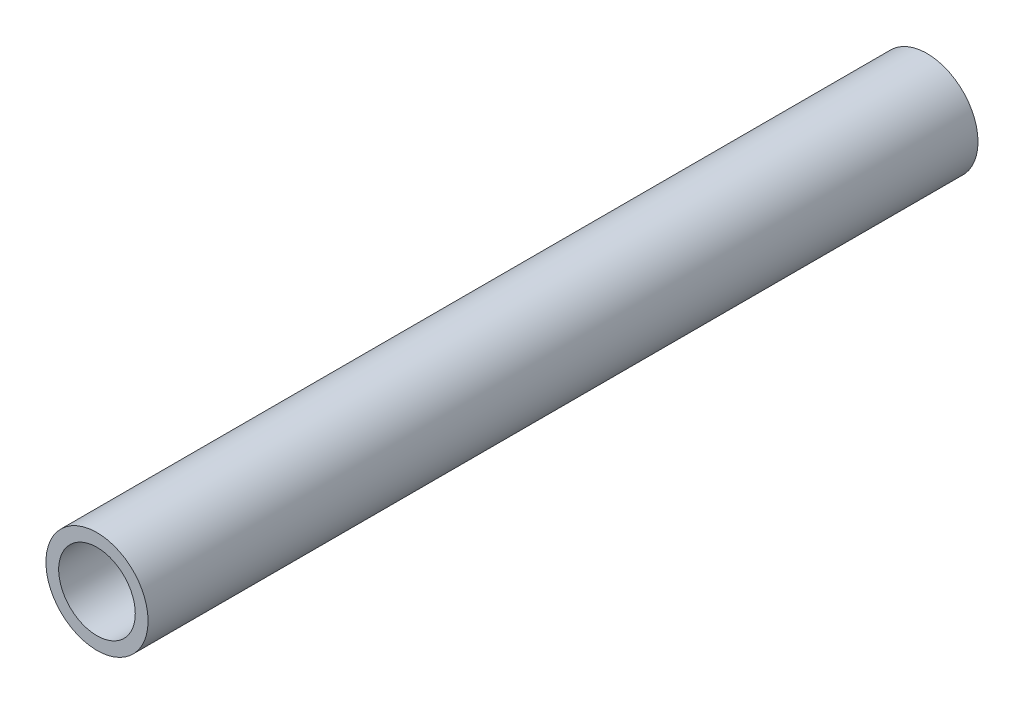
ISO-10303-21;
HEADER;
FILE_DESCRIPTION(('STEP AP214'),'2;1');
FILE_NAME('part.step','',(''),(''),'','','');
FILE_SCHEMA(('AUTOMOTIVE_DESIGN { 1 0 10303 214 1 1 1 1 }'));
ENDSEC;
DATA;
#1=APPLICATION_CONTEXT('core data for automotive mechanical design processes');
#2=APPLICATION_PROTOCOL_DEFINITION('international standard','automotive_design',2000,#1);
#3=PRODUCT_CONTEXT('',#1,'mechanical');
#4=PRODUCT('Part','Part','',(#3));
#5=PRODUCT_RELATED_PRODUCT_CATEGORY('part','',(#4));
#6=PRODUCT_DEFINITION_FORMATION('','',#4);
#7=PRODUCT_DEFINITION_CONTEXT('part definition',#1,'design');
#8=PRODUCT_DEFINITION('design','',#6,#7);
#9=PRODUCT_DEFINITION_SHAPE('','',#8);
#10=(LENGTH_UNIT() NAMED_UNIT(*) SI_UNIT(.MILLI.,.METRE.));
#11=(NAMED_UNIT(*) PLANE_ANGLE_UNIT() SI_UNIT($,.RADIAN.));
#12=(NAMED_UNIT(*) SI_UNIT($,.STERADIAN.) SOLID_ANGLE_UNIT());
#13=UNCERTAINTY_MEASURE_WITH_UNIT(LENGTH_MEASURE(1.E-05),#10,'distance_accuracy_value','');
#14=(GEOMETRIC_REPRESENTATION_CONTEXT(3) GLOBAL_UNCERTAINTY_ASSIGNED_CONTEXT((#13)) GLOBAL_UNIT_ASSIGNED_CONTEXT((#10,
#11,#12)) REPRESENTATION_CONTEXT('',''));
#15=CARTESIAN_POINT('',(0.,0.,0.));
#16=DIRECTION('',(0.,0.,1.));
#17=DIRECTION('',(1.,0.,0.));
#18=AXIS2_PLACEMENT_3D('',#15,#16,#17);
#19=CARTESIAN_POINT('',(0.,0.,130.));
#20=DIRECTION('',(0.,0.,1.));
#21=DIRECTION('',(1.,0.,0.));
#22=AXIS2_PLACEMENT_3D('',#19,#20,#21);
#23=PLANE('',#22);
#24=CARTESIAN_POINT('',(0.,0.,130.));
#25=DIRECTION('',(0.,0.,1.));
#26=DIRECTION('',(1.,0.,0.));
#27=AXIS2_PLACEMENT_3D('',#24,#25,#26);
#28=CIRCLE('',#27,8.);
#29=CARTESIAN_POINT('',(8.,0.,130.));
#30=VERTEX_POINT('',#29);
#31=EDGE_CURVE('E10',#30,#30,#28,.T.);
#32=ORIENTED_EDGE('',*,*,#31,.T.);
#33=EDGE_LOOP('',(#32));
#34=FACE_BOUND('',#33,.T.);
#35=CARTESIAN_POINT('',(0.,0.,130.));
#36=DIRECTION('',(0.,0.,1.));
#37=DIRECTION('',(1.,0.,0.));
#38=AXIS2_PLACEMENT_3D('',#35,#36,#37);
#39=CIRCLE('',#38,6.);
#40=CARTESIAN_POINT('',(6.,0.,130.));
#41=VERTEX_POINT('',#40);
#42=EDGE_CURVE('E43',#41,#41,#39,.T.);
#43=ORIENTED_EDGE('',*,*,#42,.F.);
#44=EDGE_LOOP('',(#43));
#45=FACE_BOUND('',#44,.T.);
#46=ADVANCED_FACE('F32',(#34,#45),#23,.T.);
#47=CARTESIAN_POINT('',(0.,0.,0.));
#48=DIRECTION('',(0.,0.,1.));
#49=DIRECTION('',(1.,0.,0.));
#50=AXIS2_PLACEMENT_3D('',#47,#48,#49);
#51=PLANE('',#50);
#52=CARTESIAN_POINT('',(0.,0.,0.));
#53=DIRECTION('',(0.,0.,1.));
#54=DIRECTION('',(1.,0.,0.));
#55=AXIS2_PLACEMENT_3D('',#52,#53,#54);
#56=CIRCLE('',#55,8.);
#57=CARTESIAN_POINT('',(8.,0.,0.));
#58=VERTEX_POINT('',#57);
#59=EDGE_CURVE('E36',#58,#58,#56,.T.);
#60=ORIENTED_EDGE('',*,*,#59,.F.);
#61=EDGE_LOOP('',(#60));
#62=FACE_BOUND('',#61,.T.);
#63=CARTESIAN_POINT('',(0.,0.,0.));
#64=DIRECTION('',(0.,0.,1.));
#65=DIRECTION('',(1.,0.,0.));
#66=AXIS2_PLACEMENT_3D('',#63,#64,#65);
#67=CIRCLE('',#66,6.);
#68=CARTESIAN_POINT('',(6.,0.,0.));
#69=VERTEX_POINT('',#68);
#70=EDGE_CURVE('E45',#69,#69,#67,.T.);
#71=ORIENTED_EDGE('',*,*,#70,.T.);
#72=EDGE_LOOP('',(#71));
#73=FACE_BOUND('',#72,.T.);
#74=ADVANCED_FACE('F55',(#62,#73),#51,.F.);
#75=CARTESIAN_POINT('',(0.,0.,130.));
#76=DIRECTION('',(0.,0.,-1.));
#77=DIRECTION('',(-1.,0.,0.));
#78=AXIS2_PLACEMENT_3D('',#75,#76,#77);
#79=CYLINDRICAL_SURFACE('',#78,8.);
#80=ORIENTED_EDGE('',*,*,#31,.F.);
#81=EDGE_LOOP('',(#80));
#82=FACE_BOUND('',#81,.T.);
#83=ORIENTED_EDGE('',*,*,#59,.T.);
#84=EDGE_LOOP('',(#83));
#85=FACE_BOUND('',#84,.T.);
#86=ADVANCED_FACE('F34',(#82,#85),#79,.T.);
#87=CARTESIAN_POINT('',(0.,0.,130.));
#88=DIRECTION('',(0.,0.,-1.));
#89=DIRECTION('',(-1.,0.,0.));
#90=AXIS2_PLACEMENT_3D('',#87,#88,#89);
#91=CYLINDRICAL_SURFACE('',#90,6.);
#92=ORIENTED_EDGE('',*,*,#42,.T.);
#93=EDGE_LOOP('',(#92));
#94=FACE_BOUND('',#93,.T.);
#95=ORIENTED_EDGE('',*,*,#70,.F.);
#96=EDGE_LOOP('',(#95));
#97=FACE_BOUND('',#96,.T.);
#98=ADVANCED_FACE('F51',(#94,#97),#91,.F.);
#99=CLOSED_SHELL('',(#46,#74,#86,#98));
#100=MANIFOLD_SOLID_BREP('B2',#99);
#101=ADVANCED_BREP_SHAPE_REPRESENTATION('',(#18,#100),#14);
#102=SHAPE_DEFINITION_REPRESENTATION(#9,#101);
ENDSEC;
END-ISO-10303-21;
